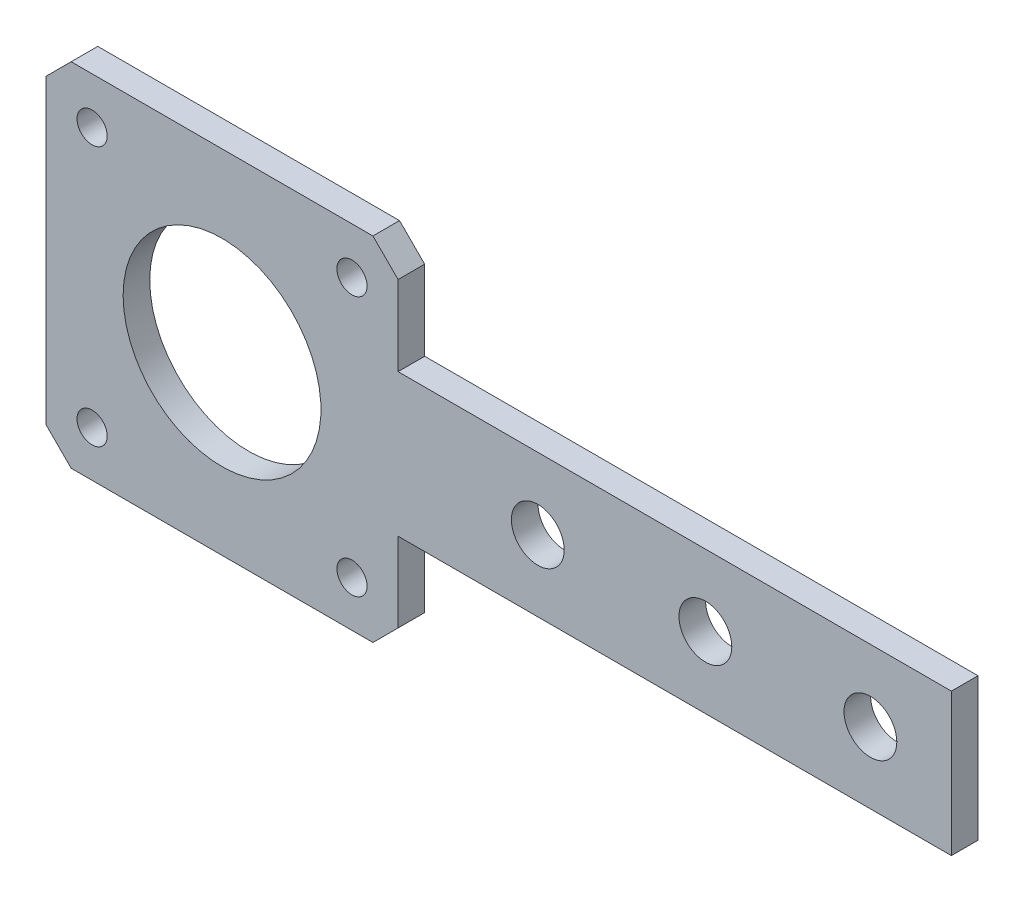
ISO-10303-21;
HEADER;
FILE_DESCRIPTION(('STEP AP214'),'2;1');
FILE_NAME('part.step','',(''),(''),'','','');
FILE_SCHEMA(('AUTOMOTIVE_DESIGN { 1 0 10303 214 1 1 1 1 }'));
ENDSEC;
DATA;
#1=APPLICATION_CONTEXT('core data for automotive mechanical design processes');
#2=APPLICATION_PROTOCOL_DEFINITION('international standard','automotive_design',2000,#1);
#3=PRODUCT_CONTEXT('',#1,'mechanical');
#4=PRODUCT('Part','Part','',(#3));
#5=PRODUCT_RELATED_PRODUCT_CATEGORY('part','',(#4));
#6=PRODUCT_DEFINITION_FORMATION('','',#4);
#7=PRODUCT_DEFINITION_CONTEXT('part definition',#1,'design');
#8=PRODUCT_DEFINITION('design','',#6,#7);
#9=PRODUCT_DEFINITION_SHAPE('','',#8);
#10=(LENGTH_UNIT() NAMED_UNIT(*) SI_UNIT(.MILLI.,.METRE.));
#11=(NAMED_UNIT(*) PLANE_ANGLE_UNIT() SI_UNIT($,.RADIAN.));
#12=(NAMED_UNIT(*) SI_UNIT($,.STERADIAN.) SOLID_ANGLE_UNIT());
#13=UNCERTAINTY_MEASURE_WITH_UNIT(LENGTH_MEASURE(1.E-05),#10,'distance_accuracy_value','');
#14=(GEOMETRIC_REPRESENTATION_CONTEXT(3) GLOBAL_UNCERTAINTY_ASSIGNED_CONTEXT((#13)) GLOBAL_UNIT_ASSIGNED_CONTEXT((#10,
#11,#12)) REPRESENTATION_CONTEXT('',''));
#15=CARTESIAN_POINT('',(0.,0.,0.));
#16=DIRECTION('',(0.,0.,1.));
#17=DIRECTION('',(1.,0.,0.));
#18=AXIS2_PLACEMENT_3D('',#15,#16,#17);
#19=CARTESIAN_POINT('',(-1013.58632196022,1446.02837211485,3.17499999999993));
#20=DIRECTION('',(-0.707106781186574,0.707106781186521,0.));
#21=DIRECTION('',(-0.707106781186521,-0.707106781186574,0.));
#22=AXIS2_PLACEMENT_3D('',#19,#20,#21);
#23=PLANE('',#22);
#24=DIRECTION('',(0.707106781186521,0.707106781186574,0.));
#25=VECTOR('',#24,1.);
#26=CARTESIAN_POINT('',(-1013.58632196022,1446.02837211485,0.));
#27=LINE('',#26,#25);
#28=CARTESIAN_POINT('',(-1013.58632196022,1446.02837211485,0.));
#29=VERTEX_POINT('',#28);
#30=CARTESIAN_POINT('',(-1010.58632196022,1449.02837211485,0.));
#31=VERTEX_POINT('',#30);
#32=EDGE_CURVE('E169',#29,#31,#27,.T.);
#33=ORIENTED_EDGE('',*,*,#32,.T.);
#34=DIRECTION('',(0.,0.,-1.));
#35=VECTOR('',#34,1.);
#36=CARTESIAN_POINT('',(-1010.58632196022,1449.02837211485,3.17500000000004));
#37=LINE('',#36,#35);
#38=CARTESIAN_POINT('',(-1010.58632196022,1449.02837211485,3.17500000000004));
#39=VERTEX_POINT('',#38);
#40=EDGE_CURVE('E11',#39,#31,#37,.T.);
#41=ORIENTED_EDGE('',*,*,#40,.F.);
#42=DIRECTION('',(0.707106781186521,0.707106781186574,0.));
#43=VECTOR('',#42,1.);
#44=CARTESIAN_POINT('',(-1013.58632196022,1446.02837211485,3.17499999999993));
#45=LINE('',#44,#43);
#46=CARTESIAN_POINT('',(-1013.58632196022,1446.02837211485,3.17499999999993));
#47=VERTEX_POINT('',#46);
#48=EDGE_CURVE('E204',#47,#39,#45,.T.);
#49=ORIENTED_EDGE('',*,*,#48,.F.);
#50=DIRECTION('',(0.,0.,-1.));
#51=VECTOR('',#50,1.);
#52=CARTESIAN_POINT('',(-1013.58632196022,1446.02837211485,3.17499999999993));
#53=LINE('',#52,#51);
#54=EDGE_CURVE('E165',#47,#29,#53,.T.);
#55=ORIENTED_EDGE('',*,*,#54,.T.);
#56=EDGE_LOOP('',(#33,#41,#49,#55));
#57=FACE_BOUND('',#56,.T.);
#58=ADVANCED_FACE('F43',(#57),#23,.F.);
#59=CARTESIAN_POINT('',(-1010.58632196022,1449.02837211485,3.17500000000004));
#60=DIRECTION('',(-1.,0.,0.));
#61=DIRECTION('',(0.,-1.,0.));
#62=AXIS2_PLACEMENT_3D('',#59,#60,#61);
#63=PLANE('',#62);
#64=DIRECTION('',(0.,1.,0.));
#65=VECTOR('',#64,1.);
#66=CARTESIAN_POINT('',(-1010.58632196022,1449.02837211485,0.));
#67=LINE('',#66,#65);
#68=CARTESIAN_POINT('',(-1010.58632196022,1458.51123406619,0.));
#69=VERTEX_POINT('',#68);
#70=EDGE_CURVE('E173',#31,#69,#67,.T.);
#71=ORIENTED_EDGE('',*,*,#70,.T.);
#72=DIRECTION('',(0.,0.,-1.));
#73=VECTOR('',#72,1.);
#74=CARTESIAN_POINT('',(-1010.58632196022,1458.51123406619,3.17500000000004));
#75=LINE('',#74,#73);
#76=CARTESIAN_POINT('',(-1010.58632196022,1458.51123406619,3.17500000000004));
#77=VERTEX_POINT('',#76);
#78=EDGE_CURVE('E52',#77,#69,#75,.T.);
#79=ORIENTED_EDGE('',*,*,#78,.F.);
#80=DIRECTION('',(0.,1.,0.));
#81=VECTOR('',#80,1.);
#82=CARTESIAN_POINT('',(-1010.58632196022,1449.02837211485,3.17500000000004));
#83=LINE('',#82,#81);
#84=EDGE_CURVE('E115',#39,#77,#83,.T.);
#85=ORIENTED_EDGE('',*,*,#84,.F.);
#86=ORIENTED_EDGE('',*,*,#40,.T.);
#87=EDGE_LOOP('',(#71,#79,#85,#86));
#88=FACE_BOUND('',#87,.T.);
#89=ADVANCED_FACE('F306',(#88),#63,.F.);
#90=CARTESIAN_POINT('',(-1010.58632196022,1458.51123406619,3.17500000000004));
#91=DIRECTION('',(0.,1.,0.));
#92=DIRECTION('',(-1.,0.,0.));
#93=AXIS2_PLACEMENT_3D('',#90,#91,#92);
#94=PLANE('',#93);
#95=DIRECTION('',(1.,0.,0.));
#96=VECTOR('',#95,1.);
#97=CARTESIAN_POINT('',(-1010.58632196022,1458.51123406619,0.));
#98=LINE('',#97,#96);
#99=CARTESIAN_POINT('',(-944.581241408057,1458.51123406619,0.));
#100=VERTEX_POINT('',#99);
#101=EDGE_CURVE('E177',#69,#100,#98,.T.);
#102=ORIENTED_EDGE('',*,*,#101,.T.);
#103=DIRECTION('',(0.,0.,-1.));
#104=VECTOR('',#103,1.);
#105=CARTESIAN_POINT('',(-944.581241408057,1458.51123406619,3.17500000000004));
#106=LINE('',#105,#104);
#107=CARTESIAN_POINT('',(-944.581241408057,1458.51123406619,3.17500000000004));
#108=VERTEX_POINT('',#107);
#109=EDGE_CURVE('E231',#108,#100,#106,.T.);
#110=ORIENTED_EDGE('',*,*,#109,.F.);
#111=DIRECTION('',(1.,0.,0.));
#112=VECTOR('',#111,1.);
#113=CARTESIAN_POINT('',(-1010.58632196022,1458.51123406619,3.17500000000004));
#114=LINE('',#113,#112);
#115=EDGE_CURVE('E242',#77,#108,#114,.T.);
#116=ORIENTED_EDGE('',*,*,#115,.F.);
#117=ORIENTED_EDGE('',*,*,#78,.T.);
#118=EDGE_LOOP('',(#102,#110,#116,#117));
#119=FACE_BOUND('',#118,.T.);
#120=ADVANCED_FACE('F240',(#119),#94,.F.);
#121=CARTESIAN_POINT('',(-944.581241408057,1458.51123406619,3.17500000000004));
#122=DIRECTION('',(-1.,0.,0.));
#123=DIRECTION('',(0.,0.,1.));
#124=AXIS2_PLACEMENT_3D('',#121,#122,#123);
#125=PLANE('',#124);
#126=DIRECTION('',(0.,1.,0.));
#127=VECTOR('',#126,1.);
#128=CARTESIAN_POINT('',(-944.581241408057,1458.51123406619,0.));
#129=LINE('',#128,#127);
#130=CARTESIAN_POINT('',(-944.581241408057,1475.51123406619,-2.22044604925031E-13));
#131=VERTEX_POINT('',#130);
#132=EDGE_CURVE('E180',#100,#131,#129,.T.);
#133=ORIENTED_EDGE('',*,*,#132,.T.);
#134=DIRECTION('',(0.,0.,-1.));
#135=VECTOR('',#134,1.);
#136=CARTESIAN_POINT('',(-944.581241408057,1475.51123406619,3.17499999999982));
#137=LINE('',#136,#135);
#138=CARTESIAN_POINT('',(-944.581241408057,1475.51123406619,3.17499999999982));
#139=VERTEX_POINT('',#138);
#140=EDGE_CURVE('E227',#139,#131,#137,.T.);
#141=ORIENTED_EDGE('',*,*,#140,.F.);
#142=DIRECTION('',(0.,1.,0.));
#143=VECTOR('',#142,1.);
#144=CARTESIAN_POINT('',(-944.581241408057,1458.51123406619,3.17500000000004));
#145=LINE('',#144,#143);
#146=EDGE_CURVE('E261',#108,#139,#145,.T.);
#147=ORIENTED_EDGE('',*,*,#146,.F.);
#148=ORIENTED_EDGE('',*,*,#109,.T.);
#149=EDGE_LOOP('',(#133,#141,#147,#148));
#150=FACE_BOUND('',#149,.T.);
#151=ADVANCED_FACE('F251',(#150),#125,.F.);
#152=CARTESIAN_POINT('',(-944.581241408057,1475.51123406619,3.17499999999982));
#153=DIRECTION('',(0.,-1.,0.));
#154=DIRECTION('',(1.,0.,0.));
#155=AXIS2_PLACEMENT_3D('',#152,#153,#154);
#156=PLANE('',#155);
#157=DIRECTION('',(-1.,0.,0.));
#158=VECTOR('',#157,1.);
#159=CARTESIAN_POINT('',(-944.581241408057,1475.51123406619,-2.22044604925031E-13));
#160=LINE('',#159,#158);
#161=CARTESIAN_POINT('',(-1010.58632196022,1475.51123406619,-2.22044604925031E-13));
#162=VERTEX_POINT('',#161);
#163=EDGE_CURVE('E183',#131,#162,#160,.T.);
#164=ORIENTED_EDGE('',*,*,#163,.T.);
#165=DIRECTION('',(0.,0.,-1.));
#166=VECTOR('',#165,1.);
#167=CARTESIAN_POINT('',(-1010.58632196022,1475.51123406619,3.17499999999982));
#168=LINE('',#167,#166);
#169=CARTESIAN_POINT('',(-1010.58632196022,1475.51123406619,3.17499999999982));
#170=VERTEX_POINT('',#169);
#171=EDGE_CURVE('E223',#170,#162,#168,.T.);
#172=ORIENTED_EDGE('',*,*,#171,.F.);
#173=DIRECTION('',(-1.,0.,0.));
#174=VECTOR('',#173,1.);
#175=CARTESIAN_POINT('',(-944.581241408057,1475.51123406619,3.17499999999982));
#176=LINE('',#175,#174);
#177=EDGE_CURVE('E257',#139,#170,#176,.T.);
#178=ORIENTED_EDGE('',*,*,#177,.F.);
#179=ORIENTED_EDGE('',*,*,#140,.T.);
#180=EDGE_LOOP('',(#164,#172,#178,#179));
#181=FACE_BOUND('',#180,.T.);
#182=ADVANCED_FACE('F255',(#181),#156,.F.);
#183=CARTESIAN_POINT('',(-1010.58632196022,1475.51123406619,3.17499999999982));
#184=DIRECTION('',(-1.,0.,0.));
#185=DIRECTION('',(0.,-1.,0.));
#186=AXIS2_PLACEMENT_3D('',#183,#184,#185);
#187=PLANE('',#186);
#188=DIRECTION('',(0.,1.,0.));
#189=VECTOR('',#188,1.);
#190=CARTESIAN_POINT('',(-1010.58632196022,1475.51123406619,-2.22044604925031E-13));
#191=LINE('',#190,#189);
#192=CARTESIAN_POINT('',(-1010.58632196022,1485.02837211485,-2.22044604925031E-13));
#193=VERTEX_POINT('',#192);
#194=EDGE_CURVE('E186',#162,#193,#191,.T.);
#195=ORIENTED_EDGE('',*,*,#194,.T.);
#196=DIRECTION('',(0.,0.,-1.));
#197=VECTOR('',#196,1.);
#198=CARTESIAN_POINT('',(-1010.58632196022,1485.02837211485,3.17499999999982));
#199=LINE('',#198,#197);
#200=CARTESIAN_POINT('',(-1010.58632196022,1485.02837211485,3.17499999999982));
#201=VERTEX_POINT('',#200);
#202=EDGE_CURVE('E219',#201,#193,#199,.T.);
#203=ORIENTED_EDGE('',*,*,#202,.F.);
#204=DIRECTION('',(0.,1.,0.));
#205=VECTOR('',#204,1.);
#206=CARTESIAN_POINT('',(-1010.58632196022,1475.51123406619,3.17499999999982));
#207=LINE('',#206,#205);
#208=EDGE_CURVE('E260',#170,#201,#207,.T.);
#209=ORIENTED_EDGE('',*,*,#208,.F.);
#210=ORIENTED_EDGE('',*,*,#171,.T.);
#211=EDGE_LOOP('',(#195,#203,#209,#210));
#212=FACE_BOUND('',#211,.T.);
#213=ADVANCED_FACE('F319',(#212),#187,.F.);
#214=CARTESIAN_POINT('',(-1010.58632196022,1485.02837211485,3.17499999999982));
#215=DIRECTION('',(-0.707106781186548,-0.707106781186548,0.));
#216=DIRECTION('',(0.707106781186548,-0.707106781186548,0.));
#217=AXIS2_PLACEMENT_3D('',#214,#215,#216);
#218=PLANE('',#217);
#219=DIRECTION('',(-0.707106781186547,0.707106781186547,0.));
#220=VECTOR('',#219,1.);
#221=CARTESIAN_POINT('',(-1010.58632196022,1485.02837211485,-2.22044604925031E-13));
#222=LINE('',#221,#220);
#223=CARTESIAN_POINT('',(-1013.58632196022,1488.02837211485,0.));
#224=VERTEX_POINT('',#223);
#225=EDGE_CURVE('E189',#193,#224,#222,.T.);
#226=ORIENTED_EDGE('',*,*,#225,.T.);
#227=DIRECTION('',(0.,0.,-1.));
#228=VECTOR('',#227,1.);
#229=CARTESIAN_POINT('',(-1013.58632196022,1488.02837211485,3.17499999999993));
#230=LINE('',#229,#228);
#231=CARTESIAN_POINT('',(-1013.58632196022,1488.02837211485,3.17499999999993));
#232=VERTEX_POINT('',#231);
#233=EDGE_CURVE('E215',#232,#224,#230,.T.);
#234=ORIENTED_EDGE('',*,*,#233,.F.);
#235=DIRECTION('',(-0.707106781186547,0.707106781186547,0.));
#236=VECTOR('',#235,1.);
#237=CARTESIAN_POINT('',(-1010.58632196022,1485.02837211485,3.17499999999982));
#238=LINE('',#237,#236);
#239=EDGE_CURVE('E266',#201,#232,#238,.T.);
#240=ORIENTED_EDGE('',*,*,#239,.F.);
#241=ORIENTED_EDGE('',*,*,#202,.T.);
#242=EDGE_LOOP('',(#226,#234,#240,#241));
#243=FACE_BOUND('',#242,.T.);
#244=ADVANCED_FACE('F322',(#243),#218,.F.);
#245=CARTESIAN_POINT('',(-1013.58632196022,1488.02837211485,3.17499999999993));
#246=DIRECTION('',(0.,-1.,0.));
#247=DIRECTION('',(1.,0.,0.));
#248=AXIS2_PLACEMENT_3D('',#245,#246,#247);
#249=PLANE('',#248);
#250=DIRECTION('',(-1.,0.,0.));
#251=VECTOR('',#250,1.);
#252=CARTESIAN_POINT('',(-1013.58632196022,1488.02837211485,0.));
#253=LINE('',#252,#251);
#254=CARTESIAN_POINT('',(-1049.58632196022,1488.02837211485,0.));
#255=VERTEX_POINT('',#254);
#256=EDGE_CURVE('E192',#224,#255,#253,.T.);
#257=ORIENTED_EDGE('',*,*,#256,.T.);
#258=DIRECTION('',(0.,0.,-1.));
#259=VECTOR('',#258,1.);
#260=CARTESIAN_POINT('',(-1049.58632196022,1488.02837211485,3.17499999999993));
#261=LINE('',#260,#259);
#262=CARTESIAN_POINT('',(-1049.58632196022,1488.02837211485,3.17499999999993));
#263=VERTEX_POINT('',#262);
#264=EDGE_CURVE('E211',#263,#255,#261,.T.);
#265=ORIENTED_EDGE('',*,*,#264,.F.);
#266=DIRECTION('',(-1.,0.,0.));
#267=VECTOR('',#266,1.);
#268=CARTESIAN_POINT('',(-1013.58632196022,1488.02837211485,3.17499999999993));
#269=LINE('',#268,#267);
#270=EDGE_CURVE('E273',#232,#263,#269,.T.);
#271=ORIENTED_EDGE('',*,*,#270,.F.);
#272=ORIENTED_EDGE('',*,*,#233,.T.);
#273=EDGE_LOOP('',(#257,#265,#271,#272));
#274=FACE_BOUND('',#273,.T.);
#275=ADVANCED_FACE('F286',(#274),#249,.F.);
#276=CARTESIAN_POINT('',(-1049.58632196022,1488.02837211485,3.17499999999993));
#277=DIRECTION('',(0.707106781186548,-0.707106781186548,0.));
#278=DIRECTION('',(0.707106781186548,0.707106781186548,0.));
#279=AXIS2_PLACEMENT_3D('',#276,#277,#278);
#280=PLANE('',#279);
#281=DIRECTION('',(-0.707106781186547,-0.707106781186547,0.));
#282=VECTOR('',#281,1.);
#283=CARTESIAN_POINT('',(-1049.58632196022,1488.02837211485,0.));
#284=LINE('',#283,#282);
#285=CARTESIAN_POINT('',(-1052.58632196022,1485.02837211485,-2.22044604925031E-13));
#286=VERTEX_POINT('',#285);
#287=EDGE_CURVE('E195',#255,#286,#284,.T.);
#288=ORIENTED_EDGE('',*,*,#287,.T.);
#289=DIRECTION('',(0.,0.,-1.));
#290=VECTOR('',#289,1.);
#291=CARTESIAN_POINT('',(-1052.58632196022,1485.02837211485,3.17499999999982));
#292=LINE('',#291,#290);
#293=CARTESIAN_POINT('',(-1052.58632196022,1485.02837211485,3.17499999999982));
#294=VERTEX_POINT('',#293);
#295=EDGE_CURVE('E157',#294,#286,#292,.T.);
#296=ORIENTED_EDGE('',*,*,#295,.F.);
#297=DIRECTION('',(-0.707106781186547,-0.707106781186547,0.));
#298=VECTOR('',#297,1.);
#299=CARTESIAN_POINT('',(-1049.58632196022,1488.02837211485,3.17499999999993));
#300=LINE('',#299,#298);
#301=EDGE_CURVE('E146',#263,#294,#300,.T.);
#302=ORIENTED_EDGE('',*,*,#301,.F.);
#303=ORIENTED_EDGE('',*,*,#264,.T.);
#304=EDGE_LOOP('',(#288,#296,#302,#303));
#305=FACE_BOUND('',#304,.T.);
#306=ADVANCED_FACE('F290',(#305),#280,.F.);
#307=CARTESIAN_POINT('',(-1052.58632196022,1485.02837211485,3.17499999999982));
#308=DIRECTION('',(1.,0.,0.));
#309=DIRECTION('',(0.,1.,0.));
#310=AXIS2_PLACEMENT_3D('',#307,#308,#309);
#311=PLANE('',#310);
#312=DIRECTION('',(0.,-1.,0.));
#313=VECTOR('',#312,1.);
#314=CARTESIAN_POINT('',(-1052.58632196022,1485.02837211485,-2.22044604925031E-13));
#315=LINE('',#314,#313);
#316=CARTESIAN_POINT('',(-1052.58632196022,1449.02837211485,0.));
#317=VERTEX_POINT('',#316);
#318=EDGE_CURVE('E155',#286,#317,#315,.T.);
#319=ORIENTED_EDGE('',*,*,#318,.T.);
#320=DIRECTION('',(0.,0.,-1.));
#321=VECTOR('',#320,1.);
#322=CARTESIAN_POINT('',(-1052.58632196022,1449.02837211485,3.17500000000004));
#323=LINE('',#322,#321);
#324=CARTESIAN_POINT('',(-1052.58632196022,1449.02837211485,3.17500000000004));
#325=VERTEX_POINT('',#324);
#326=EDGE_CURVE('E152',#325,#317,#323,.T.);
#327=ORIENTED_EDGE('',*,*,#326,.F.);
#328=DIRECTION('',(0.,-1.,0.));
#329=VECTOR('',#328,1.);
#330=CARTESIAN_POINT('',(-1052.58632196022,1485.02837211485,3.17499999999982));
#331=LINE('',#330,#329);
#332=EDGE_CURVE('E140',#294,#325,#331,.T.);
#333=ORIENTED_EDGE('',*,*,#332,.F.);
#334=ORIENTED_EDGE('',*,*,#295,.T.);
#335=EDGE_LOOP('',(#319,#327,#333,#334));
#336=FACE_BOUND('',#335,.T.);
#337=ADVANCED_FACE('F153',(#336),#311,.F.);
#338=CARTESIAN_POINT('',(-1052.58632196022,1449.02837211485,3.17500000000004));
#339=DIRECTION('',(0.707106781186521,0.707106781186574,0.));
#340=DIRECTION('',(-0.707106781186574,0.707106781186521,0.));
#341=AXIS2_PLACEMENT_3D('',#338,#339,#340);
#342=PLANE('',#341);
#343=DIRECTION('',(0.707106781186574,-0.707106781186521,0.));
#344=VECTOR('',#343,1.);
#345=CARTESIAN_POINT('',(-1052.58632196022,1449.02837211485,0.));
#346=LINE('',#345,#344);
#347=CARTESIAN_POINT('',(-1049.58632196022,1446.02837211485,0.));
#348=VERTEX_POINT('',#347);
#349=EDGE_CURVE('E101',#317,#348,#346,.T.);
#350=ORIENTED_EDGE('',*,*,#349,.T.);
#351=DIRECTION('',(0.,0.,-1.));
#352=VECTOR('',#351,1.);
#353=CARTESIAN_POINT('',(-1049.58632196022,1446.02837211485,3.17499999999993));
#354=LINE('',#353,#352);
#355=CARTESIAN_POINT('',(-1049.58632196022,1446.02837211485,3.17499999999993));
#356=VERTEX_POINT('',#355);
#357=EDGE_CURVE('E158',#356,#348,#354,.T.);
#358=ORIENTED_EDGE('',*,*,#357,.F.);
#359=DIRECTION('',(0.707106781186574,-0.707106781186521,0.));
#360=VECTOR('',#359,1.);
#361=CARTESIAN_POINT('',(-1052.58632196022,1449.02837211485,3.17500000000004));
#362=LINE('',#361,#360);
#363=EDGE_CURVE('E144',#325,#356,#362,.T.);
#364=ORIENTED_EDGE('',*,*,#363,.F.);
#365=ORIENTED_EDGE('',*,*,#326,.T.);
#366=EDGE_LOOP('',(#350,#358,#364,#365));
#367=FACE_BOUND('',#366,.T.);
#368=ADVANCED_FACE('F160',(#367),#342,.F.);
#369=CARTESIAN_POINT('',(-1049.58632196022,1446.02837211485,3.17499999999993));
#370=DIRECTION('',(0.,1.,0.));
#371=DIRECTION('',(-1.,0.,0.));
#372=AXIS2_PLACEMENT_3D('',#369,#370,#371);
#373=PLANE('',#372);
#374=DIRECTION('',(1.,0.,0.));
#375=VECTOR('',#374,1.);
#376=CARTESIAN_POINT('',(-1049.58632196022,1446.02837211485,0.));
#377=LINE('',#376,#375);
#378=EDGE_CURVE('E107',#348,#29,#377,.T.);
#379=ORIENTED_EDGE('',*,*,#378,.T.);
#380=ORIENTED_EDGE('',*,*,#54,.F.);
#381=DIRECTION('',(1.,0.,0.));
#382=VECTOR('',#381,1.);
#383=CARTESIAN_POINT('',(-1049.58632196022,1446.02837211485,3.17499999999993));
#384=LINE('',#383,#382);
#385=EDGE_CURVE('E60',#356,#47,#384,.T.);
#386=ORIENTED_EDGE('',*,*,#385,.F.);
#387=ORIENTED_EDGE('',*,*,#357,.T.);
#388=EDGE_LOOP('',(#379,#380,#386,#387));
#389=FACE_BOUND('',#388,.T.);
#390=ADVANCED_FACE('F294',(#389),#373,.F.);
#391=CARTESIAN_POINT('',(0.,0.,3.17500000000004));
#392=DIRECTION('',(0.,0.,1.));
#393=DIRECTION('',(1.,0.,0.));
#394=AXIS2_PLACEMENT_3D('',#391,#392,#393);
#395=PLANE('',#394);
#396=CARTESIAN_POINT('',(-954.24139361352,1466.99031502465,3.17499999999993));
#397=DIRECTION('',(0.,0.,1.));
#398=DIRECTION('',(1.,0.,0.));
#399=AXIS2_PLACEMENT_3D('',#396,#397,#398);
#400=CIRCLE('',#399,3.15000000000022);
#401=CARTESIAN_POINT('',(-951.09139361352,1466.99031502465,3.17499999999993));
#402=VERTEX_POINT('',#401);
#403=EDGE_CURVE('E449',#402,#402,#400,.T.);
#404=ORIENTED_EDGE('',*,*,#403,.F.);
#405=EDGE_LOOP('',(#404));
#406=FACE_BOUND('',#405,.T.);
#407=CARTESIAN_POINT('',(-973.927184785031,1466.98620525338,3.17499999999993));
#408=DIRECTION('',(0.,0.,1.));
#409=DIRECTION('',(1.,0.,0.));
#410=AXIS2_PLACEMENT_3D('',#407,#408,#409);
#411=CIRCLE('',#410,3.14999999999988);
#412=CARTESIAN_POINT('',(-970.777184785031,1466.98620525338,3.17499999999993));
#413=VERTEX_POINT('',#412);
#414=EDGE_CURVE('E451',#413,#413,#411,.T.);
#415=ORIENTED_EDGE('',*,*,#414,.F.);
#416=EDGE_LOOP('',(#415));
#417=FACE_BOUND('',#416,.T.);
#418=CARTESIAN_POINT('',(-993.918310146744,1466.99031502465,3.17499999999993));
#419=DIRECTION('',(0.,0.,1.));
#420=DIRECTION('',(1.,0.,0.));
#421=AXIS2_PLACEMENT_3D('',#418,#419,#420);
#422=CIRCLE('',#421,3.14999999999988);
#423=CARTESIAN_POINT('',(-990.768310146744,1466.99031502465,3.17499999999993));
#424=VERTEX_POINT('',#423);
#425=EDGE_CURVE('E465',#424,#424,#422,.T.);
#426=ORIENTED_EDGE('',*,*,#425,.F.);
#427=EDGE_LOOP('',(#426));
#428=FACE_BOUND('',#427,.T.);
#429=CARTESIAN_POINT('',(-1016.08632196022,1482.49409601753,3.17500000000004));
#430=DIRECTION('',(0.,0.,-1.));
#431=DIRECTION('',(-1.,0.,0.));
#432=AXIS2_PLACEMENT_3D('',#429,#430,#431);
#433=CIRCLE('',#432,1.79999999999998);
#434=CARTESIAN_POINT('',(-1017.88632196022,1482.49409601753,3.17500000000004));
#435=VERTEX_POINT('',#434);
#436=EDGE_CURVE('E456',#435,#435,#433,.T.);
#437=ORIENTED_EDGE('',*,*,#436,.T.);
#438=EDGE_LOOP('',(#437));
#439=FACE_BOUND('',#438,.T.);
#440=CARTESIAN_POINT('',(-1016.08632196022,1451.49409601753,3.17499999999982));
#441=DIRECTION('',(0.,0.,-1.));
#442=DIRECTION('',(-1.,0.,0.));
#443=AXIS2_PLACEMENT_3D('',#440,#441,#442);
#444=CIRCLE('',#443,1.79999999999998);
#445=CARTESIAN_POINT('',(-1017.88632196022,1451.49409601753,3.17499999999982));
#446=VERTEX_POINT('',#445);
#447=EDGE_CURVE('E494',#446,#446,#444,.T.);
#448=ORIENTED_EDGE('',*,*,#447,.T.);
#449=EDGE_LOOP('',(#448));
#450=FACE_BOUND('',#449,.T.);
#451=CARTESIAN_POINT('',(-1047.08632196022,1451.49409601753,3.17499999999982));
#452=DIRECTION('',(0.,0.,-1.));
#453=DIRECTION('',(-1.,0.,0.));
#454=AXIS2_PLACEMENT_3D('',#451,#452,#453);
#455=CIRCLE('',#454,1.79999999999998);
#456=CARTESIAN_POINT('',(-1048.88632196022,1451.49409601753,3.17499999999982));
#457=VERTEX_POINT('',#456);
#458=EDGE_CURVE('E486',#457,#457,#455,.T.);
#459=ORIENTED_EDGE('',*,*,#458,.T.);
#460=EDGE_LOOP('',(#459));
#461=FACE_BOUND('',#460,.T.);
#462=CARTESIAN_POINT('',(-1047.08632196022,1482.49409601753,3.17500000000004));
#463=DIRECTION('',(0.,0.,-1.));
#464=DIRECTION('',(-1.,0.,0.));
#465=AXIS2_PLACEMENT_3D('',#462,#463,#464);
#466=CIRCLE('',#465,1.79999999999998);
#467=CARTESIAN_POINT('',(-1048.88632196022,1482.49409601753,3.17500000000004));
#468=VERTEX_POINT('',#467);
#469=EDGE_CURVE('E478',#468,#468,#466,.T.);
#470=ORIENTED_EDGE('',*,*,#469,.T.);
#471=EDGE_LOOP('',(#470));
#472=FACE_BOUND('',#471,.T.);
#473=CARTESIAN_POINT('',(-1031.58632196022,1466.99409601753,3.17499999999993));
#474=DIRECTION('',(0.,0.,-1.));
#475=DIRECTION('',(-1.,0.,0.));
#476=AXIS2_PLACEMENT_3D('',#473,#474,#475);
#477=CIRCLE('',#476,11.8000000000001);
#478=CARTESIAN_POINT('',(-1043.38632196022,1466.99409601753,3.17499999999993));
#479=VERTEX_POINT('',#478);
#480=EDGE_CURVE('E174',#479,#479,#477,.T.);
#481=ORIENTED_EDGE('',*,*,#480,.T.);
#482=EDGE_LOOP('',(#481));
#483=FACE_BOUND('',#482,.T.);
#484=ORIENTED_EDGE('',*,*,#48,.T.);
#485=ORIENTED_EDGE('',*,*,#84,.T.);
#486=ORIENTED_EDGE('',*,*,#115,.T.);
#487=ORIENTED_EDGE('',*,*,#146,.T.);
#488=ORIENTED_EDGE('',*,*,#177,.T.);
#489=ORIENTED_EDGE('',*,*,#208,.T.);
#490=ORIENTED_EDGE('',*,*,#239,.T.);
#491=ORIENTED_EDGE('',*,*,#270,.T.);
#492=ORIENTED_EDGE('',*,*,#301,.T.);
#493=ORIENTED_EDGE('',*,*,#332,.T.);
#494=ORIENTED_EDGE('',*,*,#363,.T.);
#495=ORIENTED_EDGE('',*,*,#385,.T.);
#496=EDGE_LOOP('',(#484,#485,#486,#487,#488,#489,#490,#491,#492,#493,#494,#495));
#497=FACE_BOUND('',#496,.T.);
#498=ADVANCED_FACE('F142',(#406,#417,#428,#439,#450,#461,#472,#483,#497),#395,.T.);
#499=CARTESIAN_POINT('',(0.,0.,0.));
#500=DIRECTION('',(0.,0.,1.));
#501=DIRECTION('',(1.,0.,0.));
#502=AXIS2_PLACEMENT_3D('',#499,#500,#501);
#503=PLANE('',#502);
#504=CARTESIAN_POINT('',(-954.24139361352,1466.99031502465,0.));
#505=DIRECTION('',(0.,0.,1.));
#506=DIRECTION('',(1.,0.,0.));
#507=AXIS2_PLACEMENT_3D('',#504,#505,#506);
#508=CIRCLE('',#507,3.15000000000022);
#509=CARTESIAN_POINT('',(-951.09139361352,1466.99031502465,0.));
#510=VERTEX_POINT('',#509);
#511=EDGE_CURVE('E446',#510,#510,#508,.T.);
#512=ORIENTED_EDGE('',*,*,#511,.T.);
#513=EDGE_LOOP('',(#512));
#514=FACE_BOUND('',#513,.T.);
#515=CARTESIAN_POINT('',(-973.927184785031,1466.98620525338,0.));
#516=DIRECTION('',(0.,0.,1.));
#517=DIRECTION('',(1.,0.,0.));
#518=AXIS2_PLACEMENT_3D('',#515,#516,#517);
#519=CIRCLE('',#518,3.14999999999988);
#520=CARTESIAN_POINT('',(-970.777184785031,1466.98620525338,0.));
#521=VERTEX_POINT('',#520);
#522=EDGE_CURVE('E459',#521,#521,#519,.T.);
#523=ORIENTED_EDGE('',*,*,#522,.T.);
#524=EDGE_LOOP('',(#523));
#525=FACE_BOUND('',#524,.T.);
#526=CARTESIAN_POINT('',(-993.918310146744,1466.99031502465,0.));
#527=DIRECTION('',(0.,0.,1.));
#528=DIRECTION('',(1.,0.,0.));
#529=AXIS2_PLACEMENT_3D('',#526,#527,#528);
#530=CIRCLE('',#529,3.14999999999988);
#531=CARTESIAN_POINT('',(-990.768310146744,1466.99031502465,0.));
#532=VERTEX_POINT('',#531);
#533=EDGE_CURVE('E469',#532,#532,#530,.T.);
#534=ORIENTED_EDGE('',*,*,#533,.T.);
#535=EDGE_LOOP('',(#534));
#536=FACE_BOUND('',#535,.T.);
#537=CARTESIAN_POINT('',(-1016.08632196022,1482.49409601753,0.));
#538=DIRECTION('',(0.,0.,-1.));
#539=DIRECTION('',(-1.,0.,0.));
#540=AXIS2_PLACEMENT_3D('',#537,#538,#539);
#541=CIRCLE('',#540,1.79999999999998);
#542=CARTESIAN_POINT('',(-1017.88632196022,1482.49409601753,0.));
#543=VERTEX_POINT('',#542);
#544=EDGE_CURVE('E498',#543,#543,#541,.T.);
#545=ORIENTED_EDGE('',*,*,#544,.F.);
#546=EDGE_LOOP('',(#545));
#547=FACE_BOUND('',#546,.T.);
#548=CARTESIAN_POINT('',(-1016.08632196022,1451.49409601753,-2.22044604925031E-13));
#549=DIRECTION('',(0.,0.,-1.));
#550=DIRECTION('',(-1.,0.,0.));
#551=AXIS2_PLACEMENT_3D('',#548,#549,#550);
#552=CIRCLE('',#551,1.79999999999998);
#553=CARTESIAN_POINT('',(-1017.88632196022,1451.49409601753,-2.22044604925031E-13));
#554=VERTEX_POINT('',#553);
#555=EDGE_CURVE('E490',#554,#554,#552,.T.);
#556=ORIENTED_EDGE('',*,*,#555,.F.);
#557=EDGE_LOOP('',(#556));
#558=FACE_BOUND('',#557,.T.);
#559=CARTESIAN_POINT('',(-1047.08632196022,1451.49409601753,-2.22044604925031E-13));
#560=DIRECTION('',(0.,0.,-1.));
#561=DIRECTION('',(-1.,0.,0.));
#562=AXIS2_PLACEMENT_3D('',#559,#560,#561);
#563=CIRCLE('',#562,1.79999999999998);
#564=CARTESIAN_POINT('',(-1048.88632196022,1451.49409601753,-2.22044604925031E-13));
#565=VERTEX_POINT('',#564);
#566=EDGE_CURVE('E482',#565,#565,#563,.T.);
#567=ORIENTED_EDGE('',*,*,#566,.F.);
#568=EDGE_LOOP('',(#567));
#569=FACE_BOUND('',#568,.T.);
#570=CARTESIAN_POINT('',(-1047.08632196022,1482.49409601753,0.));
#571=DIRECTION('',(0.,0.,-1.));
#572=DIRECTION('',(-1.,0.,0.));
#573=AXIS2_PLACEMENT_3D('',#570,#571,#572);
#574=CIRCLE('',#573,1.79999999999998);
#575=CARTESIAN_POINT('',(-1048.88632196022,1482.49409601753,0.));
#576=VERTEX_POINT('',#575);
#577=EDGE_CURVE('E473',#576,#576,#574,.T.);
#578=ORIENTED_EDGE('',*,*,#577,.F.);
#579=EDGE_LOOP('',(#578));
#580=FACE_BOUND('',#579,.T.);
#581=CARTESIAN_POINT('',(-1031.58632196022,1466.99409601753,0.));
#582=DIRECTION('',(0.,0.,-1.));
#583=DIRECTION('',(-1.,0.,0.));
#584=AXIS2_PLACEMENT_3D('',#581,#582,#583);
#585=CIRCLE('',#584,11.8000000000001);
#586=CARTESIAN_POINT('',(-1043.38632196022,1466.99409601753,0.));
#587=VERTEX_POINT('',#586);
#588=EDGE_CURVE('E477',#587,#587,#585,.T.);
#589=ORIENTED_EDGE('',*,*,#588,.F.);
#590=EDGE_LOOP('',(#589));
#591=FACE_BOUND('',#590,.T.);
#592=ORIENTED_EDGE('',*,*,#32,.F.);
#593=ORIENTED_EDGE('',*,*,#378,.F.);
#594=ORIENTED_EDGE('',*,*,#349,.F.);
#595=ORIENTED_EDGE('',*,*,#318,.F.);
#596=ORIENTED_EDGE('',*,*,#287,.F.);
#597=ORIENTED_EDGE('',*,*,#256,.F.);
#598=ORIENTED_EDGE('',*,*,#225,.F.);
#599=ORIENTED_EDGE('',*,*,#194,.F.);
#600=ORIENTED_EDGE('',*,*,#163,.F.);
#601=ORIENTED_EDGE('',*,*,#132,.F.);
#602=ORIENTED_EDGE('',*,*,#101,.F.);
#603=ORIENTED_EDGE('',*,*,#70,.F.);
#604=EDGE_LOOP('',(#592,#593,#594,#595,#596,#597,#598,#599,#600,#601,#602,#603));
#605=FACE_BOUND('',#604,.T.);
#606=ADVANCED_FACE('F246',(#514,#525,#536,#547,#558,#569,#580,#591,#605),#503,.F.);
#607=CARTESIAN_POINT('',(-1031.58632196022,1466.99409601753,3.17499999999993));
#608=DIRECTION('',(0.,0.,-1.));
#609=DIRECTION('',(-1.,0.,0.));
#610=AXIS2_PLACEMENT_3D('',#607,#608,#609);
#611=CYLINDRICAL_SURFACE('',#610,11.8000000000001);
#612=ORIENTED_EDGE('',*,*,#480,.F.);
#613=EDGE_LOOP('',(#612));
#614=FACE_BOUND('',#613,.T.);
#615=ORIENTED_EDGE('',*,*,#588,.T.);
#616=EDGE_LOOP('',(#615));
#617=FACE_BOUND('',#616,.T.);
#618=ADVANCED_FACE('F361',(#614,#617),#611,.F.);
#619=CARTESIAN_POINT('',(-1047.08632196022,1482.49409601753,3.17500000000004));
#620=DIRECTION('',(0.,0.,-1.));
#621=DIRECTION('',(-1.,0.,0.));
#622=AXIS2_PLACEMENT_3D('',#619,#620,#621);
#623=CYLINDRICAL_SURFACE('',#622,1.79999999999998);
#624=ORIENTED_EDGE('',*,*,#469,.F.);
#625=EDGE_LOOP('',(#624));
#626=FACE_BOUND('',#625,.T.);
#627=ORIENTED_EDGE('',*,*,#577,.T.);
#628=EDGE_LOOP('',(#627));
#629=FACE_BOUND('',#628,.T.);
#630=ADVANCED_FACE('F370',(#626,#629),#623,.F.);
#631=CARTESIAN_POINT('',(-1047.08632196022,1451.49409601753,3.17499999999982));
#632=DIRECTION('',(0.,0.,-1.));
#633=DIRECTION('',(-1.,0.,0.));
#634=AXIS2_PLACEMENT_3D('',#631,#632,#633);
#635=CYLINDRICAL_SURFACE('',#634,1.79999999999998);
#636=ORIENTED_EDGE('',*,*,#458,.F.);
#637=EDGE_LOOP('',(#636));
#638=FACE_BOUND('',#637,.T.);
#639=ORIENTED_EDGE('',*,*,#566,.T.);
#640=EDGE_LOOP('',(#639));
#641=FACE_BOUND('',#640,.T.);
#642=ADVANCED_FACE('F380',(#638,#641),#635,.F.);
#643=CARTESIAN_POINT('',(-1016.08632196022,1451.49409601753,3.17499999999982));
#644=DIRECTION('',(0.,0.,-1.));
#645=DIRECTION('',(-1.,0.,0.));
#646=AXIS2_PLACEMENT_3D('',#643,#644,#645);
#647=CYLINDRICAL_SURFACE('',#646,1.79999999999998);
#648=ORIENTED_EDGE('',*,*,#447,.F.);
#649=EDGE_LOOP('',(#648));
#650=FACE_BOUND('',#649,.T.);
#651=ORIENTED_EDGE('',*,*,#555,.T.);
#652=EDGE_LOOP('',(#651));
#653=FACE_BOUND('',#652,.T.);
#654=ADVANCED_FACE('F390',(#650,#653),#647,.F.);
#655=CARTESIAN_POINT('',(-1016.08632196022,1482.49409601753,3.17500000000004));
#656=DIRECTION('',(0.,0.,-1.));
#657=DIRECTION('',(-1.,0.,0.));
#658=AXIS2_PLACEMENT_3D('',#655,#656,#657);
#659=CYLINDRICAL_SURFACE('',#658,1.79999999999998);
#660=ORIENTED_EDGE('',*,*,#436,.F.);
#661=EDGE_LOOP('',(#660));
#662=FACE_BOUND('',#661,.T.);
#663=ORIENTED_EDGE('',*,*,#544,.T.);
#664=EDGE_LOOP('',(#663));
#665=FACE_BOUND('',#664,.T.);
#666=ADVANCED_FACE('F400',(#662,#665),#659,.F.);
#667=CARTESIAN_POINT('',(-993.918310146744,1466.99031502465,0.));
#668=DIRECTION('',(0.,0.,1.));
#669=DIRECTION('',(1.,0.,0.));
#670=AXIS2_PLACEMENT_3D('',#667,#668,#669);
#671=CYLINDRICAL_SURFACE('',#670,3.14999999999988);
#672=ORIENTED_EDGE('',*,*,#533,.F.);
#673=EDGE_LOOP('',(#672));
#674=FACE_BOUND('',#673,.T.);
#675=ORIENTED_EDGE('',*,*,#425,.T.);
#676=EDGE_LOOP('',(#675));
#677=FACE_BOUND('',#676,.T.);
#678=ADVANCED_FACE('F410',(#674,#677),#671,.F.);
#679=CARTESIAN_POINT('',(-973.927184785031,1466.98620525338,0.));
#680=DIRECTION('',(0.,0.,1.));
#681=DIRECTION('',(1.,0.,0.));
#682=AXIS2_PLACEMENT_3D('',#679,#680,#681);
#683=CYLINDRICAL_SURFACE('',#682,3.14999999999988);
#684=ORIENTED_EDGE('',*,*,#522,.F.);
#685=EDGE_LOOP('',(#684));
#686=FACE_BOUND('',#685,.T.);
#687=ORIENTED_EDGE('',*,*,#414,.T.);
#688=EDGE_LOOP('',(#687));
#689=FACE_BOUND('',#688,.T.);
#690=ADVANCED_FACE('F420',(#686,#689),#683,.F.);
#691=CARTESIAN_POINT('',(-954.24139361352,1466.99031502465,0.));
#692=DIRECTION('',(0.,0.,1.));
#693=DIRECTION('',(1.,0.,0.));
#694=AXIS2_PLACEMENT_3D('',#691,#692,#693);
#695=CYLINDRICAL_SURFACE('',#694,3.15000000000022);
#696=ORIENTED_EDGE('',*,*,#511,.F.);
#697=EDGE_LOOP('',(#696));
#698=FACE_BOUND('',#697,.T.);
#699=ORIENTED_EDGE('',*,*,#403,.T.);
#700=EDGE_LOOP('',(#699));
#701=FACE_BOUND('',#700,.T.);
#702=ADVANCED_FACE('F430',(#698,#701),#695,.F.);
#703=CLOSED_SHELL('',(#58,#89,#120,#151,#182,#213,#244,#275,#306,#337,#368,#390,#498,#606,#618,
#630,#642,#654,#666,#678,#690,#702));
#704=MANIFOLD_SOLID_BREP('B2',#703);
#705=ADVANCED_BREP_SHAPE_REPRESENTATION('',(#18,#704),#14);
#706=SHAPE_DEFINITION_REPRESENTATION(#9,#705);
ENDSEC;
END-ISO-10303-21;
